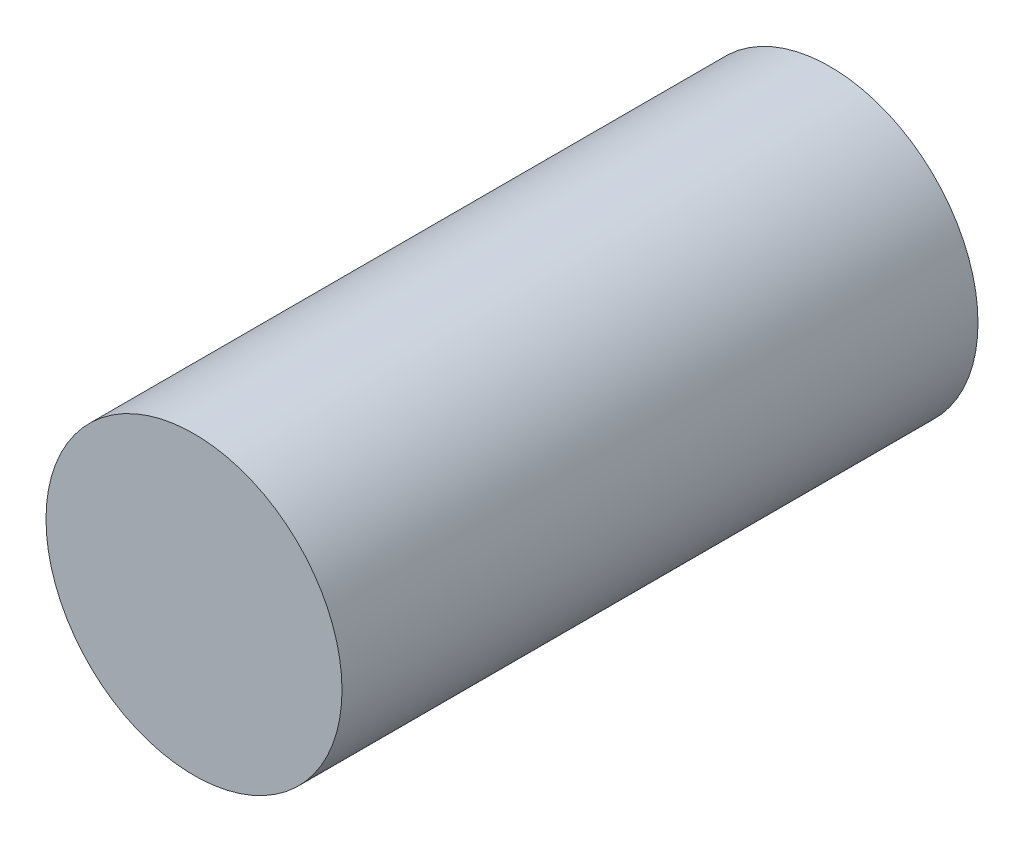
ISO-10303-21;
HEADER;
FILE_DESCRIPTION(('STEP AP214'),'2;1');
FILE_NAME('part.step','',(''),(''),'','','');
FILE_SCHEMA(('AUTOMOTIVE_DESIGN { 1 0 10303 214 1 1 1 1 }'));
ENDSEC;
DATA;
#1=APPLICATION_CONTEXT('core data for automotive mechanical design processes');
#2=APPLICATION_PROTOCOL_DEFINITION('international standard','automotive_design',2000,#1);
#3=PRODUCT_CONTEXT('',#1,'mechanical');
#4=PRODUCT('Part','Part','',(#3));
#5=PRODUCT_RELATED_PRODUCT_CATEGORY('part','',(#4));
#6=PRODUCT_DEFINITION_FORMATION('','',#4);
#7=PRODUCT_DEFINITION_CONTEXT('part definition',#1,'design');
#8=PRODUCT_DEFINITION('design','',#6,#7);
#9=PRODUCT_DEFINITION_SHAPE('','',#8);
#10=(LENGTH_UNIT() NAMED_UNIT(*) SI_UNIT(.MILLI.,.METRE.));
#11=(NAMED_UNIT(*) PLANE_ANGLE_UNIT() SI_UNIT($,.RADIAN.));
#12=(NAMED_UNIT(*) SI_UNIT($,.STERADIAN.) SOLID_ANGLE_UNIT());
#13=UNCERTAINTY_MEASURE_WITH_UNIT(LENGTH_MEASURE(1.E-05),#10,'distance_accuracy_value','');
#14=(GEOMETRIC_REPRESENTATION_CONTEXT(3) GLOBAL_UNCERTAINTY_ASSIGNED_CONTEXT((#13)) GLOBAL_UNIT_ASSIGNED_CONTEXT((#10,
#11,#12)) REPRESENTATION_CONTEXT('',''));
#15=CARTESIAN_POINT('',(0.,0.,0.));
#16=DIRECTION('',(0.,0.,1.));
#17=DIRECTION('',(1.,0.,0.));
#18=AXIS2_PLACEMENT_3D('',#15,#16,#17);
#19=CARTESIAN_POINT('',(0.,0.,15.9));
#20=DIRECTION('',(0.,0.,-1.));
#21=DIRECTION('',(-1.,0.,0.));
#22=AXIS2_PLACEMENT_3D('',#19,#20,#21);
#23=CYLINDRICAL_SURFACE('',#22,3.7);
#24=CARTESIAN_POINT('',(0.,0.,15.9));
#25=DIRECTION('',(0.,0.,1.));
#26=DIRECTION('',(1.,0.,0.));
#27=AXIS2_PLACEMENT_3D('',#24,#25,#26);
#28=CIRCLE('',#27,3.7);
#29=CARTESIAN_POINT('',(3.7,0.,15.9));
#30=VERTEX_POINT('',#29);
#31=EDGE_CURVE('E10',#30,#30,#28,.T.);
#32=ORIENTED_EDGE('',*,*,#31,.F.);
#33=EDGE_LOOP('',(#32));
#34=FACE_BOUND('',#33,.T.);
#35=CARTESIAN_POINT('',(0.,0.,0.));
#36=DIRECTION('',(0.,0.,1.));
#37=DIRECTION('',(1.,0.,0.));
#38=AXIS2_PLACEMENT_3D('',#35,#36,#37);
#39=CIRCLE('',#38,3.7);
#40=CARTESIAN_POINT('',(3.7,0.,0.));
#41=VERTEX_POINT('',#40);
#42=EDGE_CURVE('E42',#41,#41,#39,.T.);
#43=ORIENTED_EDGE('',*,*,#42,.T.);
#44=EDGE_LOOP('',(#43));
#45=FACE_BOUND('',#44,.T.);
#46=ADVANCED_FACE('F39',(#34,#45),#23,.T.);
#47=CARTESIAN_POINT('',(0.,0.,15.9));
#48=DIRECTION('',(0.,0.,1.));
#49=DIRECTION('',(1.,0.,0.));
#50=AXIS2_PLACEMENT_3D('',#47,#48,#49);
#51=PLANE('',#50);
#52=ORIENTED_EDGE('',*,*,#31,.T.);
#53=EDGE_LOOP('',(#52));
#54=FACE_BOUND('',#53,.T.);
#55=ADVANCED_FACE('F54',(#54),#51,.T.);
#56=CARTESIAN_POINT('',(0.,0.,0.));
#57=DIRECTION('',(0.,0.,1.));
#58=DIRECTION('',(1.,0.,0.));
#59=AXIS2_PLACEMENT_3D('',#56,#57,#58);
#60=PLANE('',#59);
#61=ORIENTED_EDGE('',*,*,#42,.F.);
#62=EDGE_LOOP('',(#61));
#63=FACE_BOUND('',#62,.T.);
#64=ADVANCED_FACE('F52',(#63),#60,.F.);
#65=CLOSED_SHELL('',(#46,#55,#64));
#66=MANIFOLD_SOLID_BREP('B2',#65);
#67=ADVANCED_BREP_SHAPE_REPRESENTATION('',(#18,#66),#14);
#68=SHAPE_DEFINITION_REPRESENTATION(#9,#67);
ENDSEC;
END-ISO-10303-21;
